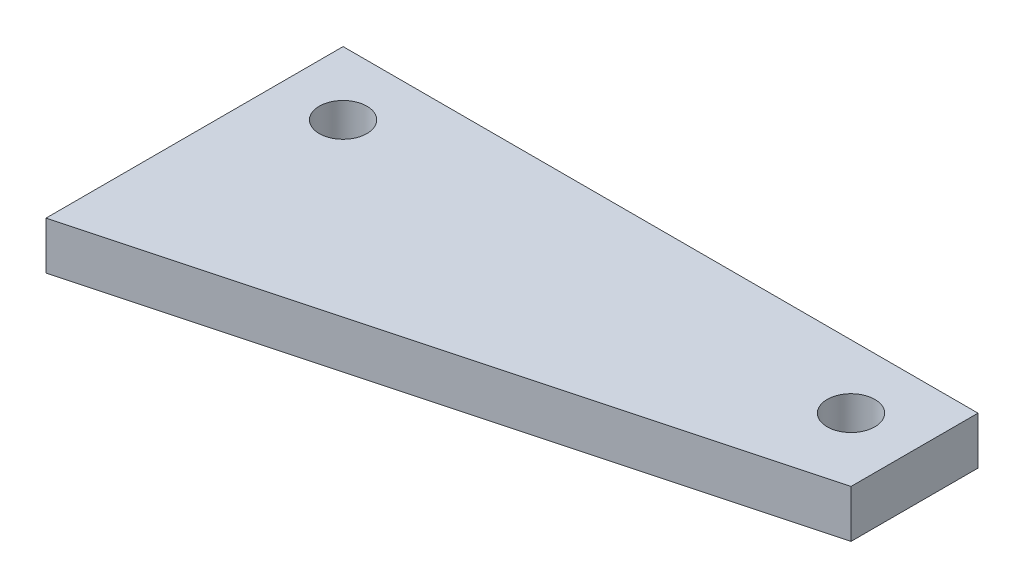
ISO-10303-21;
HEADER;
FILE_DESCRIPTION(('STEP AP214'),'2;1');
FILE_NAME('part.step','',(''),(''),'','','');
FILE_SCHEMA(('AUTOMOTIVE_DESIGN { 1 0 10303 214 1 1 1 1 }'));
ENDSEC;
DATA;
#1=APPLICATION_CONTEXT('core data for automotive mechanical design processes');
#2=APPLICATION_PROTOCOL_DEFINITION('international standard','automotive_design',2000,#1);
#3=PRODUCT_CONTEXT('',#1,'mechanical');
#4=PRODUCT('Part','Part','',(#3));
#5=PRODUCT_RELATED_PRODUCT_CATEGORY('part','',(#4));
#6=PRODUCT_DEFINITION_FORMATION('','',#4);
#7=PRODUCT_DEFINITION_CONTEXT('part definition',#1,'design');
#8=PRODUCT_DEFINITION('design','',#6,#7);
#9=PRODUCT_DEFINITION_SHAPE('','',#8);
#10=(LENGTH_UNIT() NAMED_UNIT(*) SI_UNIT(.MILLI.,.METRE.));
#11=(NAMED_UNIT(*) PLANE_ANGLE_UNIT() SI_UNIT($,.RADIAN.));
#12=(NAMED_UNIT(*) SI_UNIT($,.STERADIAN.) SOLID_ANGLE_UNIT());
#13=UNCERTAINTY_MEASURE_WITH_UNIT(LENGTH_MEASURE(1.E-05),#10,'distance_accuracy_value','');
#14=(GEOMETRIC_REPRESENTATION_CONTEXT(3) GLOBAL_UNCERTAINTY_ASSIGNED_CONTEXT((#13)) GLOBAL_UNIT_ASSIGNED_CONTEXT((#10,
#11,#12)) REPRESENTATION_CONTEXT('',''));
#15=CARTESIAN_POINT('',(0.,0.,0.));
#16=DIRECTION('',(0.,0.,1.));
#17=DIRECTION('',(1.,0.,0.));
#18=AXIS2_PLACEMENT_3D('',#15,#16,#17);
#19=CARTESIAN_POINT('',(0.,4.7625,0.));
#20=DIRECTION('',(0.,-1.,0.));
#21=DIRECTION('',(0.,0.,-1.));
#22=AXIS2_PLACEMENT_3D('',#19,#20,#21);
#23=PLANE('',#22);
#24=DIRECTION('',(0.,0.,-1.));
#25=VECTOR('',#24,1.);
#26=CARTESIAN_POINT('',(31.75,4.7625,6.35));
#27=LINE('',#26,#25);
#28=CARTESIAN_POINT('',(31.75,4.7625,6.35));
#29=VERTEX_POINT('',#28);
#30=CARTESIAN_POINT('',(31.75,4.7625,-6.35));
#31=VERTEX_POINT('',#30);
#32=EDGE_CURVE('E84',#29,#31,#27,.T.);
#33=ORIENTED_EDGE('',*,*,#32,.T.);
#34=DIRECTION('',(-1.,0.,0.));
#35=VECTOR('',#34,1.);
#36=CARTESIAN_POINT('',(-31.75,4.7625,-6.35));
#37=LINE('',#36,#35);
#38=CARTESIAN_POINT('',(-31.75,4.7625,-6.35));
#39=VERTEX_POINT('',#38);
#40=EDGE_CURVE('E79',#31,#39,#37,.T.);
#41=ORIENTED_EDGE('',*,*,#40,.T.);
#42=DIRECTION('',(0.,0.,1.));
#43=VECTOR('',#42,1.);
#44=CARTESIAN_POINT('',(-31.75,4.7625,6.35));
#45=LINE('',#44,#43);
#46=CARTESIAN_POINT('',(-31.75,4.7625,23.3647737193761));
#47=VERTEX_POINT('',#46);
#48=EDGE_CURVE('E82',#39,#47,#45,.T.);
#49=ORIENTED_EDGE('',*,*,#48,.T.);
#50=DIRECTION('',(0.965925826289069,0.,-0.258819045102518));
#51=VECTOR('',#50,1.);
#52=CARTESIAN_POINT('',(-31.75,4.7625,23.3647737193761));
#53=LINE('',#52,#51);
#54=EDGE_CURVE('E50',#47,#29,#53,.T.);
#55=ORIENTED_EDGE('',*,*,#54,.T.);
#56=EDGE_LOOP('',(#33,#41,#49,#55));
#57=FACE_BOUND('',#56,.T.);
#58=CARTESIAN_POINT('',(-25.4,4.7625,0.));
#59=DIRECTION('',(0.,1.,0.));
#60=DIRECTION('',(0.,0.,1.));
#61=AXIS2_PLACEMENT_3D('',#58,#59,#60);
#62=CIRCLE('',#61,2.38125);
#63=CARTESIAN_POINT('',(-25.4,4.7625,-2.38125));
#64=VERTEX_POINT('',#63);
#65=EDGE_CURVE('E100',#64,#64,#62,.T.);
#66=ORIENTED_EDGE('',*,*,#65,.F.);
#67=EDGE_LOOP('',(#66));
#68=FACE_BOUND('',#67,.T.);
#69=CARTESIAN_POINT('',(25.4,4.7625,0.));
#70=DIRECTION('',(0.,1.,0.));
#71=DIRECTION('',(0.,0.,1.));
#72=AXIS2_PLACEMENT_3D('',#69,#70,#71);
#73=CIRCLE('',#72,2.38125);
#74=CARTESIAN_POINT('',(25.4,4.7625,-2.38125));
#75=VERTEX_POINT('',#74);
#76=EDGE_CURVE('E115',#75,#75,#73,.T.);
#77=ORIENTED_EDGE('',*,*,#76,.F.);
#78=EDGE_LOOP('',(#77));
#79=FACE_BOUND('',#78,.T.);
#80=ADVANCED_FACE('F33',(#57,#68,#79),#23,.F.);
#81=CARTESIAN_POINT('',(0.,0.,0.));
#82=DIRECTION('',(0.,-1.,0.));
#83=DIRECTION('',(0.,0.,-1.));
#84=AXIS2_PLACEMENT_3D('',#81,#82,#83);
#85=PLANE('',#84);
#86=CARTESIAN_POINT('',(-25.4,0.,0.));
#87=DIRECTION('',(0.,1.,0.));
#88=DIRECTION('',(0.,0.,1.));
#89=AXIS2_PLACEMENT_3D('',#86,#87,#88);
#90=CIRCLE('',#89,2.38125);
#91=CARTESIAN_POINT('',(-25.4,0.,-2.38125));
#92=VERTEX_POINT('',#91);
#93=EDGE_CURVE('E112',#92,#92,#90,.T.);
#94=ORIENTED_EDGE('',*,*,#93,.T.);
#95=EDGE_LOOP('',(#94));
#96=FACE_BOUND('',#95,.T.);
#97=DIRECTION('',(0.,0.,-1.));
#98=VECTOR('',#97,1.);
#99=CARTESIAN_POINT('',(31.75,0.,6.35));
#100=LINE('',#99,#98);
#101=CARTESIAN_POINT('',(31.75,0.,6.35));
#102=VERTEX_POINT('',#101);
#103=CARTESIAN_POINT('',(31.75,0.,-6.35));
#104=VERTEX_POINT('',#103);
#105=EDGE_CURVE('E97',#102,#104,#100,.T.);
#106=ORIENTED_EDGE('',*,*,#105,.F.);
#107=DIRECTION('',(0.965925826289069,0.,-0.258819045102518));
#108=VECTOR('',#107,1.);
#109=CARTESIAN_POINT('',(-31.75,0.,23.3647737193761));
#110=LINE('',#109,#108);
#111=CARTESIAN_POINT('',(-31.75,0.,23.3647737193761));
#112=VERTEX_POINT('',#111);
#113=EDGE_CURVE('E72',#112,#102,#110,.T.);
#114=ORIENTED_EDGE('',*,*,#113,.F.);
#115=DIRECTION('',(0.,0.,1.));
#116=VECTOR('',#115,1.);
#117=CARTESIAN_POINT('',(-31.75,0.,6.35));
#118=LINE('',#117,#116);
#119=CARTESIAN_POINT('',(-31.75,0.,-6.35));
#120=VERTEX_POINT('',#119);
#121=EDGE_CURVE('E66',#120,#112,#118,.T.);
#122=ORIENTED_EDGE('',*,*,#121,.F.);
#123=DIRECTION('',(-1.,0.,0.));
#124=VECTOR('',#123,1.);
#125=CARTESIAN_POINT('',(-31.75,0.,-6.35));
#126=LINE('',#125,#124);
#127=EDGE_CURVE('E89',#104,#120,#126,.T.);
#128=ORIENTED_EDGE('',*,*,#127,.F.);
#129=EDGE_LOOP('',(#106,#114,#122,#128));
#130=FACE_BOUND('',#129,.T.);
#131=CARTESIAN_POINT('',(25.4,0.,0.));
#132=DIRECTION('',(0.,1.,0.));
#133=DIRECTION('',(0.,0.,1.));
#134=AXIS2_PLACEMENT_3D('',#131,#132,#133);
#135=CIRCLE('',#134,2.38125);
#136=CARTESIAN_POINT('',(25.4,0.,-2.38125));
#137=VERTEX_POINT('',#136);
#138=EDGE_CURVE('E118',#137,#137,#135,.T.);
#139=ORIENTED_EDGE('',*,*,#138,.T.);
#140=EDGE_LOOP('',(#139));
#141=FACE_BOUND('',#140,.T.);
#142=ADVANCED_FACE('F108',(#96,#130,#141),#85,.T.);
#143=CARTESIAN_POINT('',(31.75,4.7625,6.35));
#144=DIRECTION('',(-1.,0.,0.));
#145=DIRECTION('',(0.,0.,1.));
#146=AXIS2_PLACEMENT_3D('',#143,#144,#145);
#147=PLANE('',#146);
#148=ORIENTED_EDGE('',*,*,#105,.T.);
#149=DIRECTION('',(0.,-1.,0.));
#150=VECTOR('',#149,1.);
#151=CARTESIAN_POINT('',(31.75,4.7625,-6.35));
#152=LINE('',#151,#150);
#153=EDGE_CURVE('E11',#31,#104,#152,.T.);
#154=ORIENTED_EDGE('',*,*,#153,.F.);
#155=ORIENTED_EDGE('',*,*,#32,.F.);
#156=DIRECTION('',(0.,-1.,0.));
#157=VECTOR('',#156,1.);
#158=CARTESIAN_POINT('',(31.75,4.7625,6.35));
#159=LINE('',#158,#157);
#160=EDGE_CURVE('E93',#29,#102,#159,.T.);
#161=ORIENTED_EDGE('',*,*,#160,.T.);
#162=EDGE_LOOP('',(#148,#154,#155,#161));
#163=FACE_BOUND('',#162,.T.);
#164=ADVANCED_FACE('F35',(#163),#147,.F.);
#165=CARTESIAN_POINT('',(-31.75,4.7625,-6.35));
#166=DIRECTION('',(0.,0.,1.));
#167=DIRECTION('',(1.,0.,0.));
#168=AXIS2_PLACEMENT_3D('',#165,#166,#167);
#169=PLANE('',#168);
#170=ORIENTED_EDGE('',*,*,#127,.T.);
#171=DIRECTION('',(0.,-1.,0.));
#172=VECTOR('',#171,1.);
#173=CARTESIAN_POINT('',(-31.75,4.7625,-6.35));
#174=LINE('',#173,#172);
#175=EDGE_CURVE('E42',#39,#120,#174,.T.);
#176=ORIENTED_EDGE('',*,*,#175,.F.);
#177=ORIENTED_EDGE('',*,*,#40,.F.);
#178=ORIENTED_EDGE('',*,*,#153,.T.);
#179=EDGE_LOOP('',(#170,#176,#177,#178));
#180=FACE_BOUND('',#179,.T.);
#181=ADVANCED_FACE('F88',(#180),#169,.F.);
#182=CARTESIAN_POINT('',(-31.75,4.7625,6.35));
#183=DIRECTION('',(1.,0.,0.));
#184=DIRECTION('',(0.,0.,-1.));
#185=AXIS2_PLACEMENT_3D('',#182,#183,#184);
#186=PLANE('',#185);
#187=ORIENTED_EDGE('',*,*,#121,.T.);
#188=DIRECTION('',(0.,-1.,0.));
#189=VECTOR('',#188,1.);
#190=CARTESIAN_POINT('',(-31.75,4.7625,23.3647737193761));
#191=LINE('',#190,#189);
#192=EDGE_CURVE('E90',#47,#112,#191,.T.);
#193=ORIENTED_EDGE('',*,*,#192,.F.);
#194=ORIENTED_EDGE('',*,*,#48,.F.);
#195=ORIENTED_EDGE('',*,*,#175,.T.);
#196=EDGE_LOOP('',(#187,#193,#194,#195));
#197=FACE_BOUND('',#196,.T.);
#198=ADVANCED_FACE('F91',(#197),#186,.F.);
#199=CARTESIAN_POINT('',(-31.75,4.7625,23.3647737193761));
#200=DIRECTION('',(-0.258819045102518,0.,-0.965925826289069));
#201=DIRECTION('',(-0.965925826289069,0.,0.258819045102518));
#202=AXIS2_PLACEMENT_3D('',#199,#200,#201);
#203=PLANE('',#202);
#204=ORIENTED_EDGE('',*,*,#113,.T.);
#205=ORIENTED_EDGE('',*,*,#160,.F.);
#206=ORIENTED_EDGE('',*,*,#54,.F.);
#207=ORIENTED_EDGE('',*,*,#192,.T.);
#208=EDGE_LOOP('',(#204,#205,#206,#207));
#209=FACE_BOUND('',#208,.T.);
#210=ADVANCED_FACE('F105',(#209),#203,.F.);
#211=CARTESIAN_POINT('',(-25.4,4.7625,0.));
#212=DIRECTION('',(0.,-1.,0.));
#213=DIRECTION('',(0.,0.,-1.));
#214=AXIS2_PLACEMENT_3D('',#211,#212,#213);
#215=CYLINDRICAL_SURFACE('',#214,2.38125);
#216=CARTESIAN_POINT('',(-25.4,4.7625,-2.38125));
#217=CARTESIAN_POINT('',(-25.4,4.712890625,-2.38125));
#218=CARTESIAN_POINT('',(-25.4,4.66328125,-2.38125));
#219=CARTESIAN_POINT('',(-25.4,4.5640625,-2.38125));
#220=CARTESIAN_POINT('',(-25.4,4.514453125,-2.38125));
#221=CARTESIAN_POINT('',(-25.4,4.415234375,-2.38125));
#222=CARTESIAN_POINT('',(-25.4,4.365625,-2.38125));
#223=CARTESIAN_POINT('',(-25.4,4.26640625,-2.38125));
#224=CARTESIAN_POINT('',(-25.4,4.216796875,-2.38125));
#225=CARTESIAN_POINT('',(-25.4,4.117578125,-2.38125));
#226=CARTESIAN_POINT('',(-25.4,4.06796875,-2.38125));
#227=CARTESIAN_POINT('',(-25.4,3.96875,-2.38125));
#228=CARTESIAN_POINT('',(-25.4,3.919140625,-2.38125));
#229=CARTESIAN_POINT('',(-25.4,3.819921875,-2.38125));
#230=CARTESIAN_POINT('',(-25.4,3.7703125,-2.38125));
#231=CARTESIAN_POINT('',(-25.4,3.67109375,-2.38125));
#232=CARTESIAN_POINT('',(-25.4,3.621484375,-2.38125));
#233=CARTESIAN_POINT('',(-25.4,3.522265625,-2.38125));
#234=CARTESIAN_POINT('',(-25.4,3.47265625,-2.38125));
#235=CARTESIAN_POINT('',(-25.4,3.3734375,-2.38125));
#236=CARTESIAN_POINT('',(-25.4,3.323828125,-2.38125));
#237=CARTESIAN_POINT('',(-25.4,3.224609375,-2.38125));
#238=CARTESIAN_POINT('',(-25.4,3.175,-2.38125));
#239=CARTESIAN_POINT('',(-25.4,3.07578125,-2.38125));
#240=CARTESIAN_POINT('',(-25.4,3.026171875,-2.38125));
#241=CARTESIAN_POINT('',(-25.4,2.926953125,-2.38125));
#242=CARTESIAN_POINT('',(-25.4,2.87734375,-2.38125));
#243=CARTESIAN_POINT('',(-25.4,2.778125,-2.38125));
#244=CARTESIAN_POINT('',(-25.4,2.728515625,-2.38125));
#245=CARTESIAN_POINT('',(-25.4,2.629296875,-2.38125));
#246=CARTESIAN_POINT('',(-25.4,2.5796875,-2.38125));
#247=CARTESIAN_POINT('',(-25.4,2.48046875,-2.38125));
#248=CARTESIAN_POINT('',(-25.4,2.430859375,-2.38125));
#249=CARTESIAN_POINT('',(-25.4,2.331640625,-2.38125));
#250=CARTESIAN_POINT('',(-25.4,2.28203125,-2.38125));
#251=CARTESIAN_POINT('',(-25.4,2.1828125,-2.38125));
#252=CARTESIAN_POINT('',(-25.4,2.133203125,-2.38125));
#253=CARTESIAN_POINT('',(-25.4,2.033984375,-2.38125));
#254=CARTESIAN_POINT('',(-25.4,1.984375,-2.38125));
#255=CARTESIAN_POINT('',(-25.4,1.88515625,-2.38125));
#256=CARTESIAN_POINT('',(-25.4,1.835546875,-2.38125));
#257=CARTESIAN_POINT('',(-25.4,1.736328125,-2.38125));
#258=CARTESIAN_POINT('',(-25.4,1.68671875,-2.38125));
#259=CARTESIAN_POINT('',(-25.4,1.5875,-2.38125));
#260=CARTESIAN_POINT('',(-25.4,1.537890625,-2.38125));
#261=CARTESIAN_POINT('',(-25.4,1.438671875,-2.38125));
#262=CARTESIAN_POINT('',(-25.4,1.3890625,-2.38125));
#263=CARTESIAN_POINT('',(-25.4,1.28984375,-2.38125));
#264=CARTESIAN_POINT('',(-25.4,1.240234375,-2.38125));
#265=CARTESIAN_POINT('',(-25.4,1.141015625,-2.38125));
#266=CARTESIAN_POINT('',(-25.4,1.09140625,-2.38125));
#267=CARTESIAN_POINT('',(-25.4,0.992187499999999,-2.38125));
#268=CARTESIAN_POINT('',(-25.4,0.942578124999999,-2.38125));
#269=CARTESIAN_POINT('',(-25.4,0.843359375,-2.38125));
#270=CARTESIAN_POINT('',(-25.4,0.79375,-2.38125));
#271=CARTESIAN_POINT('',(-25.4,0.69453125,-2.38125));
#272=CARTESIAN_POINT('',(-25.4,0.644921875,-2.38125));
#273=CARTESIAN_POINT('',(-25.4,0.545703125,-2.38125));
#274=CARTESIAN_POINT('',(-25.4,0.49609375,-2.38125));
#275=CARTESIAN_POINT('',(-25.4,0.396875,-2.38125));
#276=CARTESIAN_POINT('',(-25.4,0.347265625,-2.38125));
#277=CARTESIAN_POINT('',(-25.4,0.248046875,-2.38125));
#278=CARTESIAN_POINT('',(-25.4,0.1984375,-2.38125));
#279=CARTESIAN_POINT('',(-25.4,0.09921875,-2.38125));
#280=CARTESIAN_POINT('',(-25.4,0.049609375,-2.38125));
#281=CARTESIAN_POINT('',(-25.4,0.,-2.38125));
#282=B_SPLINE_CURVE_WITH_KNOTS('',3,(#216,#217,#218,#219,#220,#221,#222,#223,#224,#225,#226,
#227,#228,#229,#230,#231,#232,#233,#234,#235,#236,#237,#238,#239,#240,#241,#242,#243,#244,#245,
#246,#247,#248,#249,#250,#251,#252,#253,#254,#255,#256,#257,#258,#259,#260,#261,#262,#263,#264,
#265,#266,#267,#268,#269,#270,#271,#272,#273,#274,#275,#276,#277,#278,#279,#280,#281),
.UNSPECIFIED.,.F.,.F.,(4,2,2,2,2,2,2,2,2,2,2,2,2,2,2,2,2,2,2,2,2,2,2,2,2,2,2,2,2,2,2,2,4),(0.,
0.148828125,0.29765625,0.446484375,0.5953125,0.744140625,0.892968750000001,1.041796875,1.190625,
1.339453125,1.48828125,1.637109375,1.7859375,1.934765625,2.08359375,2.232421875,2.38125,
2.530078125,2.67890625,2.827734375,2.9765625,3.125390625,3.27421875,3.423046875,3.571875,
3.720703125,3.86953125,4.018359375,4.1671875,4.316015625,4.46484375,4.613671875,4.7625),.UNSPECIFIED.);
#283=EDGE_CURVE('BSEAM135',#64,#92,#282,.T.);
#284=ORIENTED_EDGE('',*,*,#65,.T.);
#285=ORIENTED_EDGE('',*,*,#93,.F.);
#286=ORIENTED_EDGE('',*,*,#283,.T.);
#287=ORIENTED_EDGE('',*,*,#283,.F.);
#288=EDGE_LOOP('',(#284,#286,#285,#287));
#289=FACE_BOUND('',#288,.T.);
#290=ADVANCED_FACE('F135',(#289),#215,.F.);
#291=CARTESIAN_POINT('',(25.4,4.7625,0.));
#292=DIRECTION('',(0.,-1.,0.));
#293=DIRECTION('',(0.,0.,-1.));
#294=AXIS2_PLACEMENT_3D('',#291,#292,#293);
#295=CYLINDRICAL_SURFACE('',#294,2.38125);
#296=CARTESIAN_POINT('',(25.4,4.7625,-2.38125));
#297=CARTESIAN_POINT('',(25.4,4.712890625,-2.38125));
#298=CARTESIAN_POINT('',(25.4,4.66328125,-2.38125));
#299=CARTESIAN_POINT('',(25.4,4.5640625,-2.38125));
#300=CARTESIAN_POINT('',(25.4,4.514453125,-2.38125));
#301=CARTESIAN_POINT('',(25.4,4.415234375,-2.38125));
#302=CARTESIAN_POINT('',(25.4,4.365625,-2.38125));
#303=CARTESIAN_POINT('',(25.4,4.26640625,-2.38125));
#304=CARTESIAN_POINT('',(25.4,4.216796875,-2.38125));
#305=CARTESIAN_POINT('',(25.4,4.117578125,-2.38125));
#306=CARTESIAN_POINT('',(25.4,4.06796875,-2.38125));
#307=CARTESIAN_POINT('',(25.4,3.96875,-2.38125));
#308=CARTESIAN_POINT('',(25.4,3.919140625,-2.38125));
#309=CARTESIAN_POINT('',(25.4,3.819921875,-2.38125));
#310=CARTESIAN_POINT('',(25.4,3.7703125,-2.38125));
#311=CARTESIAN_POINT('',(25.4,3.67109375,-2.38125));
#312=CARTESIAN_POINT('',(25.4,3.621484375,-2.38125));
#313=CARTESIAN_POINT('',(25.4,3.522265625,-2.38125));
#314=CARTESIAN_POINT('',(25.4,3.47265625,-2.38125));
#315=CARTESIAN_POINT('',(25.4,3.3734375,-2.38125));
#316=CARTESIAN_POINT('',(25.4,3.323828125,-2.38125));
#317=CARTESIAN_POINT('',(25.4,3.224609375,-2.38125));
#318=CARTESIAN_POINT('',(25.4,3.175,-2.38125));
#319=CARTESIAN_POINT('',(25.4,3.07578125,-2.38125));
#320=CARTESIAN_POINT('',(25.4,3.026171875,-2.38125));
#321=CARTESIAN_POINT('',(25.4,2.926953125,-2.38125));
#322=CARTESIAN_POINT('',(25.4,2.87734375,-2.38125));
#323=CARTESIAN_POINT('',(25.4,2.778125,-2.38125));
#324=CARTESIAN_POINT('',(25.4,2.728515625,-2.38125));
#325=CARTESIAN_POINT('',(25.4,2.629296875,-2.38125));
#326=CARTESIAN_POINT('',(25.4,2.5796875,-2.38125));
#327=CARTESIAN_POINT('',(25.4,2.48046875,-2.38125));
#328=CARTESIAN_POINT('',(25.4,2.430859375,-2.38125));
#329=CARTESIAN_POINT('',(25.4,2.331640625,-2.38125));
#330=CARTESIAN_POINT('',(25.4,2.28203125,-2.38125));
#331=CARTESIAN_POINT('',(25.4,2.1828125,-2.38125));
#332=CARTESIAN_POINT('',(25.4,2.133203125,-2.38125));
#333=CARTESIAN_POINT('',(25.4,2.033984375,-2.38125));
#334=CARTESIAN_POINT('',(25.4,1.984375,-2.38125));
#335=CARTESIAN_POINT('',(25.4,1.88515625,-2.38125));
#336=CARTESIAN_POINT('',(25.4,1.835546875,-2.38125));
#337=CARTESIAN_POINT('',(25.4,1.736328125,-2.38125));
#338=CARTESIAN_POINT('',(25.4,1.68671875,-2.38125));
#339=CARTESIAN_POINT('',(25.4,1.5875,-2.38125));
#340=CARTESIAN_POINT('',(25.4,1.537890625,-2.38125));
#341=CARTESIAN_POINT('',(25.4,1.438671875,-2.38125));
#342=CARTESIAN_POINT('',(25.4,1.3890625,-2.38125));
#343=CARTESIAN_POINT('',(25.4,1.28984375,-2.38125));
#344=CARTESIAN_POINT('',(25.4,1.240234375,-2.38125));
#345=CARTESIAN_POINT('',(25.4,1.141015625,-2.38125));
#346=CARTESIAN_POINT('',(25.4,1.09140625,-2.38125));
#347=CARTESIAN_POINT('',(25.4,0.992187499999999,-2.38125));
#348=CARTESIAN_POINT('',(25.4,0.942578124999999,-2.38125));
#349=CARTESIAN_POINT('',(25.4,0.843359375,-2.38125));
#350=CARTESIAN_POINT('',(25.4,0.79375,-2.38125));
#351=CARTESIAN_POINT('',(25.4,0.69453125,-2.38125));
#352=CARTESIAN_POINT('',(25.4,0.644921875,-2.38125));
#353=CARTESIAN_POINT('',(25.4,0.545703125,-2.38125));
#354=CARTESIAN_POINT('',(25.4,0.49609375,-2.38125));
#355=CARTESIAN_POINT('',(25.4,0.396875,-2.38125));
#356=CARTESIAN_POINT('',(25.4,0.347265625,-2.38125));
#357=CARTESIAN_POINT('',(25.4,0.248046875,-2.38125));
#358=CARTESIAN_POINT('',(25.4,0.1984375,-2.38125));
#359=CARTESIAN_POINT('',(25.4,0.09921875,-2.38125));
#360=CARTESIAN_POINT('',(25.4,0.049609375,-2.38125));
#361=CARTESIAN_POINT('',(25.4,0.,-2.38125));
#362=B_SPLINE_CURVE_WITH_KNOTS('',3,(#296,#297,#298,#299,#300,#301,#302,#303,#304,#305,#306,
#307,#308,#309,#310,#311,#312,#313,#314,#315,#316,#317,#318,#319,#320,#321,#322,#323,#324,#325,
#326,#327,#328,#329,#330,#331,#332,#333,#334,#335,#336,#337,#338,#339,#340,#341,#342,#343,#344,
#345,#346,#347,#348,#349,#350,#351,#352,#353,#354,#355,#356,#357,#358,#359,#360,#361),
.UNSPECIFIED.,.F.,.F.,(4,2,2,2,2,2,2,2,2,2,2,2,2,2,2,2,2,2,2,2,2,2,2,2,2,2,2,2,2,2,2,2,4),(0.,
0.148828125,0.29765625,0.446484375,0.5953125,0.744140625,0.892968750000001,1.041796875,1.190625,
1.339453125,1.48828125,1.637109375,1.7859375,1.934765625,2.08359375,2.232421875,2.38125,
2.530078125,2.67890625,2.827734375,2.9765625,3.125390625,3.27421875,3.423046875,3.571875,
3.720703125,3.86953125,4.018359375,4.1671875,4.316015625,4.46484375,4.613671875,4.7625),.UNSPECIFIED.);
#363=EDGE_CURVE('BSEAM124',#75,#137,#362,.T.);
#364=ORIENTED_EDGE('',*,*,#76,.T.);
#365=ORIENTED_EDGE('',*,*,#138,.F.);
#366=ORIENTED_EDGE('',*,*,#363,.T.);
#367=ORIENTED_EDGE('',*,*,#363,.F.);
#368=EDGE_LOOP('',(#364,#366,#365,#367));
#369=FACE_BOUND('',#368,.T.);
#370=ADVANCED_FACE('F124',(#369),#295,.F.);
#371=CLOSED_SHELL('',(#80,#142,#164,#181,#198,#210,#290,#370));
#372=MANIFOLD_SOLID_BREP('B2',#371);
#373=ADVANCED_BREP_SHAPE_REPRESENTATION('',(#18,#372),#14);
#374=SHAPE_DEFINITION_REPRESENTATION(#9,#373);
ENDSEC;
END-ISO-10303-21;
